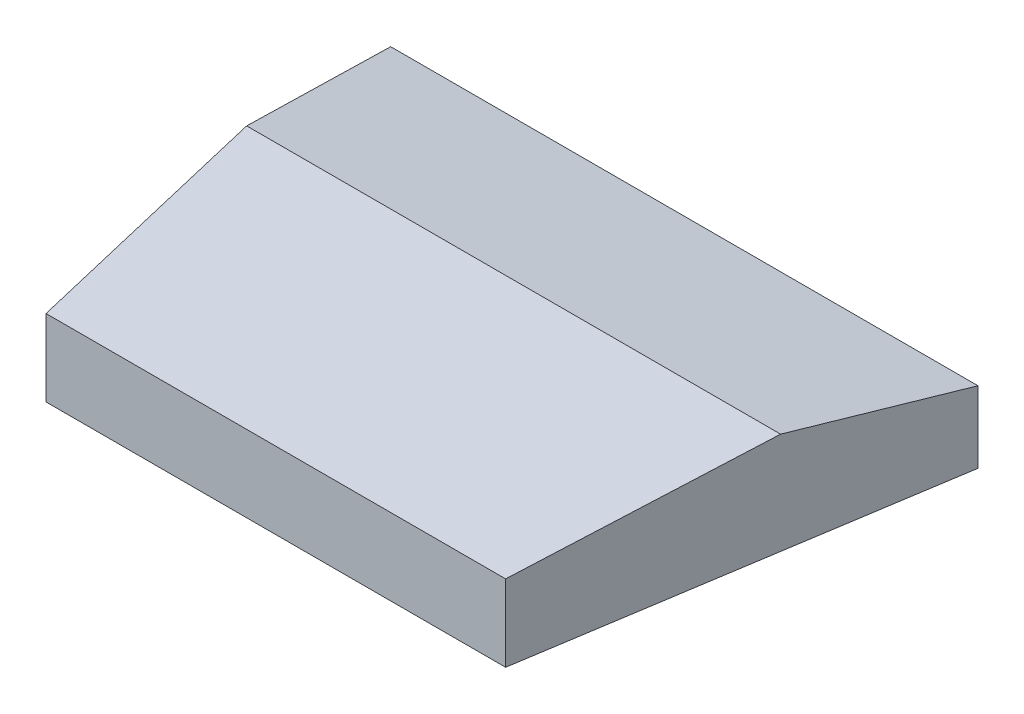
ISO-10303-21;
HEADER;
FILE_DESCRIPTION(('STEP AP214'),'2;1');
FILE_NAME('part.step','',(''),(''),'','','');
FILE_SCHEMA(('AUTOMOTIVE_DESIGN { 1 0 10303 214 1 1 1 1 }'));
ENDSEC;
DATA;
#1=APPLICATION_CONTEXT('core data for automotive mechanical design processes');
#2=APPLICATION_PROTOCOL_DEFINITION('international standard','automotive_design',2000,#1);
#3=PRODUCT_CONTEXT('',#1,'mechanical');
#4=PRODUCT('Part','Part','',(#3));
#5=PRODUCT_RELATED_PRODUCT_CATEGORY('part','',(#4));
#6=PRODUCT_DEFINITION_FORMATION('','',#4);
#7=PRODUCT_DEFINITION_CONTEXT('part definition',#1,'design');
#8=PRODUCT_DEFINITION('design','',#6,#7);
#9=PRODUCT_DEFINITION_SHAPE('','',#8);
#10=(LENGTH_UNIT() NAMED_UNIT(*) SI_UNIT(.MILLI.,.METRE.));
#11=(NAMED_UNIT(*) PLANE_ANGLE_UNIT() SI_UNIT($,.RADIAN.));
#12=(NAMED_UNIT(*) SI_UNIT($,.STERADIAN.) SOLID_ANGLE_UNIT());
#13=UNCERTAINTY_MEASURE_WITH_UNIT(LENGTH_MEASURE(1.E-05),#10,'distance_accuracy_value','');
#14=(GEOMETRIC_REPRESENTATION_CONTEXT(3) GLOBAL_UNCERTAINTY_ASSIGNED_CONTEXT((#13)) GLOBAL_UNIT_ASSIGNED_CONTEXT((#10,
#11,#12)) REPRESENTATION_CONTEXT('',''));
#15=CARTESIAN_POINT('',(0.,0.,0.));
#16=DIRECTION('',(0.,0.,1.));
#17=DIRECTION('',(1.,0.,0.));
#18=AXIS2_PLACEMENT_3D('',#15,#16,#17);
#19=CARTESIAN_POINT('',(0.,50.8,0.));
#20=DIRECTION('',(0.988012033751101,0.,-0.154376880273609));
#21=DIRECTION('',(-0.154376880273609,0.,-0.988012033751101));
#22=AXIS2_PLACEMENT_3D('',#19,#20,#21);
#23=PLANE('',#22);
#24=DIRECTION('',(-0.15355118089879,0.103288828432058,-0.982727557752259));
#25=VECTOR('',#24,1.);
#26=CARTESIAN_POINT('',(12.5664862034734,51.004118702672,80.4255117022296));
#27=LINE('',#26,#25);
#28=CARTESIAN_POINT('',(31.7499999999999,38.1,203.2));
#29=VERTEX_POINT('',#28);
#30=CARTESIAN_POINT('',(13.2676627813329,50.5324602834584,84.9130418005307));
#31=VERTEX_POINT('',#30);
#32=EDGE_CURVE('E125',#29,#31,#27,.T.);
#33=ORIENTED_EDGE('',*,*,#32,.T.);
#34=DIRECTION('',(0.152086205209686,0.171628168781002,0.973351713341995));
#35=VECTOR('',#34,1.);
#36=CARTESIAN_POINT('',(0.,35.5599999999994,0.));
#37=LINE('',#36,#35);
#38=CARTESIAN_POINT('',(0.,35.5599999999994,0.));
#39=VERTEX_POINT('',#38);
#40=EDGE_CURVE('E11',#31,#39,#37,.F.);
#41=ORIENTED_EDGE('',*,*,#40,.T.);
#42=DIRECTION('',(0.,-1.,0.));
#43=VECTOR('',#42,1.);
#44=CARTESIAN_POINT('',(0.,50.8,0.));
#45=LINE('',#44,#43);
#46=CARTESIAN_POINT('',(0.,0.,0.));
#47=VERTEX_POINT('',#46);
#48=EDGE_CURVE('E113',#39,#47,#45,.T.);
#49=ORIENTED_EDGE('',*,*,#48,.T.);
#50=DIRECTION('',(0.154376880273609,0.,0.988012033751101));
#51=VECTOR('',#50,1.);
#52=CARTESIAN_POINT('',(0.,0.,0.));
#53=LINE('',#52,#51);
#54=CARTESIAN_POINT('',(31.7499999999999,0.,203.2));
#55=VERTEX_POINT('',#54);
#56=EDGE_CURVE('E107',#47,#55,#53,.T.);
#57=ORIENTED_EDGE('',*,*,#56,.T.);
#58=DIRECTION('',(0.,-1.,0.));
#59=VECTOR('',#58,1.);
#60=CARTESIAN_POINT('',(31.7499999999999,50.8,203.2));
#61=LINE('',#60,#59);
#62=EDGE_CURVE('E90',#29,#55,#61,.T.);
#63=ORIENTED_EDGE('',*,*,#62,.F.);
#64=EDGE_LOOP('',(#33,#41,#49,#57,#63));
#65=FACE_BOUND('',#64,.T.);
#66=ADVANCED_FACE('F43',(#65),#23,.F.);
#67=CARTESIAN_POINT('',(31.7499999999999,50.8,203.2));
#68=DIRECTION('',(0.,0.,-1.));
#69=DIRECTION('',(-1.,0.,0.));
#70=AXIS2_PLACEMENT_3D('',#67,#68,#69);
#71=PLANE('',#70);
#72=DIRECTION('',(0.,-1.,0.));
#73=VECTOR('',#72,1.);
#74=CARTESIAN_POINT('',(260.35,50.8,203.2));
#75=LINE('',#74,#73);
#76=CARTESIAN_POINT('',(260.35,38.1,203.2));
#77=VERTEX_POINT('',#76);
#78=CARTESIAN_POINT('',(260.35,0.,203.2));
#79=VERTEX_POINT('',#78);
#80=EDGE_CURVE('E101',#77,#79,#75,.T.);
#81=ORIENTED_EDGE('',*,*,#80,.F.);
#82=DIRECTION('',(-1.,0.,0.));
#83=VECTOR('',#82,1.);
#84=CARTESIAN_POINT('',(31.7499999999999,38.1,203.2));
#85=LINE('',#84,#83);
#86=EDGE_CURVE('E97',#77,#29,#85,.T.);
#87=ORIENTED_EDGE('',*,*,#86,.T.);
#88=ORIENTED_EDGE('',*,*,#62,.T.);
#89=DIRECTION('',(1.,0.,0.));
#90=VECTOR('',#89,1.);
#91=CARTESIAN_POINT('',(31.7499999999999,0.,203.2));
#92=LINE('',#91,#90);
#93=EDGE_CURVE('E94',#55,#79,#92,.T.);
#94=ORIENTED_EDGE('',*,*,#93,.T.);
#95=EDGE_LOOP('',(#81,#87,#88,#94));
#96=FACE_BOUND('',#95,.T.);
#97=ADVANCED_FACE('F93',(#96),#71,.F.);
#98=CARTESIAN_POINT('',(292.1,50.8,0.));
#99=DIRECTION('',(0.988012033751101,0.,0.15437688027361));
#100=DIRECTION('',(0.15437688027361,0.,-0.988012033751101));
#101=AXIS2_PLACEMENT_3D('',#98,#99,#100);
#102=PLANE('',#101);
#103=DIRECTION('',(0.,-1.,0.));
#104=VECTOR('',#103,1.);
#105=CARTESIAN_POINT('',(292.1,50.8,0.));
#106=LINE('',#105,#104);
#107=CARTESIAN_POINT('',(292.1,35.5599999999994,0.));
#108=VERTEX_POINT('',#107);
#109=CARTESIAN_POINT('',(292.1,0.,0.));
#110=VERTEX_POINT('',#109);
#111=EDGE_CURVE('E120',#108,#110,#106,.T.);
#112=ORIENTED_EDGE('',*,*,#111,.F.);
#113=DIRECTION('',(0.152086205209687,-0.171628168781002,-0.973351713341995));
#114=VECTOR('',#113,1.);
#115=CARTESIAN_POINT('',(291.70220130009,36.0089129195828,2.54591167942494));
#116=LINE('',#115,#114);
#117=CARTESIAN_POINT('',(278.832337218667,50.5324602834584,84.9130418005308));
#118=VERTEX_POINT('',#117);
#119=EDGE_CURVE('E66',#108,#118,#116,.F.);
#120=ORIENTED_EDGE('',*,*,#119,.T.);
#121=DIRECTION('',(-0.15355118089879,-0.103288828432058,0.982727557752259));
#122=VECTOR('',#121,1.);
#123=CARTESIAN_POINT('',(291.962696063054,59.3648207641192,0.878745196452574));
#124=LINE('',#123,#122);
#125=EDGE_CURVE('E100',#118,#77,#124,.T.);
#126=ORIENTED_EDGE('',*,*,#125,.T.);
#127=ORIENTED_EDGE('',*,*,#80,.T.);
#128=DIRECTION('',(-0.15437688027361,0.,0.988012033751101));
#129=VECTOR('',#128,1.);
#130=CARTESIAN_POINT('',(292.1,0.,0.));
#131=LINE('',#130,#129);
#132=EDGE_CURVE('E110',#110,#79,#131,.T.);
#133=ORIENTED_EDGE('',*,*,#132,.F.);
#134=EDGE_LOOP('',(#112,#120,#126,#127,#133));
#135=FACE_BOUND('',#134,.T.);
#136=ADVANCED_FACE('F135',(#135),#102,.T.);
#137=CARTESIAN_POINT('',(0.,50.8,0.));
#138=DIRECTION('',(0.,0.,-1.));
#139=DIRECTION('',(-1.,0.,0.));
#140=AXIS2_PLACEMENT_3D('',#137,#138,#139);
#141=PLANE('',#140);
#142=ORIENTED_EDGE('',*,*,#48,.F.);
#143=DIRECTION('',(1.,0.,0.));
#144=VECTOR('',#143,1.);
#145=CARTESIAN_POINT('',(0.,35.5599999999994,0.));
#146=LINE('',#145,#144);
#147=EDGE_CURVE('E127',#39,#108,#146,.T.);
#148=ORIENTED_EDGE('',*,*,#147,.T.);
#149=ORIENTED_EDGE('',*,*,#111,.T.);
#150=DIRECTION('',(1.,0.,0.));
#151=VECTOR('',#150,1.);
#152=CARTESIAN_POINT('',(0.,0.,0.));
#153=LINE('',#152,#151);
#154=EDGE_CURVE('E117',#47,#110,#153,.T.);
#155=ORIENTED_EDGE('',*,*,#154,.F.);
#156=EDGE_LOOP('',(#142,#148,#149,#155));
#157=FACE_BOUND('',#156,.T.);
#158=ADVANCED_FACE('F132',(#157),#141,.T.);
#159=CARTESIAN_POINT('',(0.,0.,0.));
#160=DIRECTION('',(0.,1.,0.));
#161=DIRECTION('',(0.,0.,1.));
#162=AXIS2_PLACEMENT_3D('',#159,#160,#161);
#163=PLANE('',#162);
#164=ORIENTED_EDGE('',*,*,#56,.F.);
#165=ORIENTED_EDGE('',*,*,#154,.T.);
#166=ORIENTED_EDGE('',*,*,#132,.T.);
#167=ORIENTED_EDGE('',*,*,#93,.F.);
#168=EDGE_LOOP('',(#164,#165,#166,#167));
#169=FACE_BOUND('',#168,.T.);
#170=ADVANCED_FACE('F105',(#169),#163,.F.);
#171=CARTESIAN_POINT('',(0.,50.8,82.3675714313745));
#172=DIRECTION('',(0.,0.994521895368273,0.104528463267655));
#173=DIRECTION('',(-1.,0.,0.));
#174=AXIS2_PLACEMENT_3D('',#171,#172,#173);
#175=PLANE('',#174);
#176=ORIENTED_EDGE('',*,*,#125,.F.);
#177=DIRECTION('',(1.,0.,0.));
#178=VECTOR('',#177,1.);
#179=CARTESIAN_POINT('',(0.,50.5324602834584,84.9130418005307));
#180=LINE('',#179,#178);
#181=EDGE_CURVE('E52',#118,#31,#180,.F.);
#182=ORIENTED_EDGE('',*,*,#181,.T.);
#183=ORIENTED_EDGE('',*,*,#32,.F.);
#184=ORIENTED_EDGE('',*,*,#86,.F.);
#185=EDGE_LOOP('',(#176,#182,#183,#184));
#186=FACE_BOUND('',#185,.T.);
#187=ADVANCED_FACE('F136',(#186),#175,.T.);
#188=CARTESIAN_POINT('',(0.,35.5599999999994,0.));
#189=DIRECTION('',(0.,-0.984807753012209,0.173648177666927));
#190=DIRECTION('',(1.,0.,0.));
#191=AXIS2_PLACEMENT_3D('',#188,#189,#190);
#192=PLANE('',#191);
#193=ORIENTED_EDGE('',*,*,#40,.F.);
#194=ORIENTED_EDGE('',*,*,#181,.F.);
#195=ORIENTED_EDGE('',*,*,#119,.F.);
#196=ORIENTED_EDGE('',*,*,#147,.F.);
#197=EDGE_LOOP('',(#193,#194,#195,#196));
#198=FACE_BOUND('',#197,.T.);
#199=ADVANCED_FACE('F46',(#198),#192,.F.);
#200=CLOSED_SHELL('',(#66,#97,#136,#158,#170,#187,#199));
#201=MANIFOLD_SOLID_BREP('B2',#200);
#202=ADVANCED_BREP_SHAPE_REPRESENTATION('',(#18,#201),#14);
#203=SHAPE_DEFINITION_REPRESENTATION(#9,#202);
ENDSEC;
END-ISO-10303-21;
